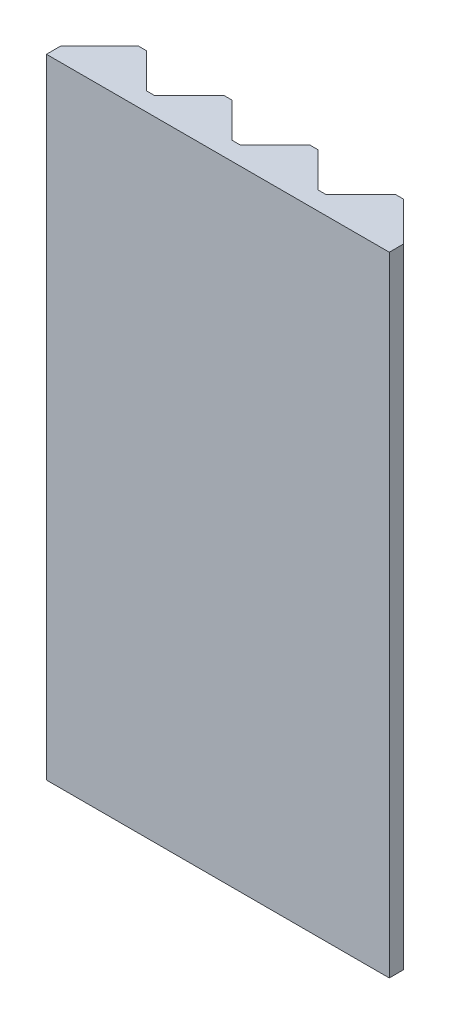
ISO-10303-21;
HEADER;
FILE_DESCRIPTION(('STEP AP214'),'2;1');
FILE_NAME('part.step','',(''),(''),'','','');
FILE_SCHEMA(('AUTOMOTIVE_DESIGN { 1 0 10303 214 1 1 1 1 }'));
ENDSEC;
DATA;
#1=APPLICATION_CONTEXT('core data for automotive mechanical design processes');
#2=APPLICATION_PROTOCOL_DEFINITION('international standard','automotive_design',2000,#1);
#3=PRODUCT_CONTEXT('',#1,'mechanical');
#4=PRODUCT('Part','Part','',(#3));
#5=PRODUCT_RELATED_PRODUCT_CATEGORY('part','',(#4));
#6=PRODUCT_DEFINITION_FORMATION('','',#4);
#7=PRODUCT_DEFINITION_CONTEXT('part definition',#1,'design');
#8=PRODUCT_DEFINITION('design','',#6,#7);
#9=PRODUCT_DEFINITION_SHAPE('','',#8);
#10=(LENGTH_UNIT() NAMED_UNIT(*) SI_UNIT(.MILLI.,.METRE.));
#11=(NAMED_UNIT(*) PLANE_ANGLE_UNIT() SI_UNIT($,.RADIAN.));
#12=(NAMED_UNIT(*) SI_UNIT($,.STERADIAN.) SOLID_ANGLE_UNIT());
#13=UNCERTAINTY_MEASURE_WITH_UNIT(LENGTH_MEASURE(1.E-05),#10,'distance_accuracy_value','');
#14=(GEOMETRIC_REPRESENTATION_CONTEXT(3) GLOBAL_UNCERTAINTY_ASSIGNED_CONTEXT((#13)) GLOBAL_UNIT_ASSIGNED_CONTEXT((#10,
#11,#12)) REPRESENTATION_CONTEXT('',''));
#15=CARTESIAN_POINT('',(0.,0.,0.));
#16=DIRECTION('',(0.,0.,1.));
#17=DIRECTION('',(1.,0.,0.));
#18=AXIS2_PLACEMENT_3D('',#15,#16,#17);
#19=CARTESIAN_POINT('',(-133.35,0.,-23.603948775785));
#20=DIRECTION('',(0.,0.,-1.));
#21=DIRECTION('',(-1.,0.,0.));
#22=AXIS2_PLACEMENT_3D('',#19,#20,#21);
#23=PLANE('',#22);
#24=DIRECTION('',(0.,1.,0.));
#25=VECTOR('',#24,1.);
#26=CARTESIAN_POINT('',(-131.553948775781,-139.7,-23.6039487757812));
#27=LINE('',#26,#25);
#28=CARTESIAN_POINT('',(-131.553948775778,-139.7,-23.6039487757841));
#29=VERTEX_POINT('',#28);
#30=CARTESIAN_POINT('',(-131.553948775779,139.7,-23.6039487757831));
#31=VERTEX_POINT('',#30);
#32=EDGE_CURVE('E206',#29,#31,#27,.T.);
#33=ORIENTED_EDGE('',*,*,#32,.F.);
#34=DIRECTION('',(1.,0.,0.));
#35=VECTOR('',#34,1.);
#36=CARTESIAN_POINT('',(0.,-139.7,-23.603948775785));
#37=LINE('',#36,#35);
#38=CARTESIAN_POINT('',(-135.146051224222,-139.7,-23.6039487757841));
#39=VERTEX_POINT('',#38);
#40=EDGE_CURVE('E148',#29,#39,#37,.F.);
#41=ORIENTED_EDGE('',*,*,#40,.T.);
#42=DIRECTION('',(0.,1.,0.));
#43=VECTOR('',#42,1.);
#44=CARTESIAN_POINT('',(-135.146051224219,-139.7,-23.6039487757812));
#45=LINE('',#44,#43);
#46=CARTESIAN_POINT('',(-135.146051224221,139.7,-23.6039487757831));
#47=VERTEX_POINT('',#46);
#48=EDGE_CURVE('E19',#47,#39,#45,.F.);
#49=ORIENTED_EDGE('',*,*,#48,.F.);
#50=DIRECTION('',(1.,0.,0.));
#51=VECTOR('',#50,1.);
#52=CARTESIAN_POINT('',(0.,139.7,-23.603948775785));
#53=LINE('',#52,#51);
#54=EDGE_CURVE('E145',#31,#47,#53,.F.);
#55=ORIENTED_EDGE('',*,*,#54,.F.);
#56=EDGE_LOOP('',(#33,#41,#49,#55));
#57=FACE_BOUND('',#56,.T.);
#58=ADVANCED_FACE('F16',(#57),#23,.T.);
#59=CARTESIAN_POINT('',(-133.35,-139.7,-25.4));
#60=DIRECTION('',(-0.707106781186548,0.,-0.707106781186548));
#61=DIRECTION('',(-0.707106781186548,0.,0.707106781186548));
#62=AXIS2_PLACEMENT_3D('',#59,#60,#61);
#63=PLANE('',#62);
#64=DIRECTION('',(-0.707106781186391,0.,0.707106781186704));
#65=VECTOR('',#64,1.);
#66=CARTESIAN_POINT('',(-135.146051224223,139.7,-23.603948775785));
#67=LINE('',#66,#65);
#68=CARTESIAN_POINT('',(-152.4,139.7,-6.35));
#69=VERTEX_POINT('',#68);
#70=EDGE_CURVE('E153',#47,#69,#67,.T.);
#71=ORIENTED_EDGE('',*,*,#70,.F.);
#72=ORIENTED_EDGE('',*,*,#48,.T.);
#73=DIRECTION('',(-0.707106781186391,0.,0.707106781186704));
#74=VECTOR('',#73,1.);
#75=CARTESIAN_POINT('',(-135.146051224223,-139.7,-23.603948775785));
#76=LINE('',#75,#74);
#77=CARTESIAN_POINT('',(-152.4,-139.7,-6.35000000000001));
#78=VERTEX_POINT('',#77);
#79=EDGE_CURVE('E261',#39,#78,#76,.T.);
#80=ORIENTED_EDGE('',*,*,#79,.T.);
#81=DIRECTION('',(0.,1.,0.));
#82=VECTOR('',#81,1.);
#83=CARTESIAN_POINT('',(-152.4,-139.7,-6.35));
#84=LINE('',#83,#82);
#85=EDGE_CURVE('E156',#69,#78,#84,.F.);
#86=ORIENTED_EDGE('',*,*,#85,.F.);
#87=EDGE_LOOP('',(#71,#72,#80,#86));
#88=FACE_BOUND('',#87,.T.);
#89=ADVANCED_FACE('F154',(#88),#63,.T.);
#90=CARTESIAN_POINT('',(-19.05,0.,-23.603948775785));
#91=DIRECTION('',(0.,0.,-1.));
#92=DIRECTION('',(-1.,0.,0.));
#93=AXIS2_PLACEMENT_3D('',#90,#91,#92);
#94=PLANE('',#93);
#95=DIRECTION('',(0.,1.,0.));
#96=VECTOR('',#95,1.);
#97=CARTESIAN_POINT('',(-17.253948775785,-139.7,-23.603948775785));
#98=LINE('',#97,#96);
#99=CARTESIAN_POINT('',(-17.253948775785,-139.7,-23.603948775785));
#100=VERTEX_POINT('',#99);
#101=CARTESIAN_POINT('',(-17.253948775785,139.7,-23.603948775785));
#102=VERTEX_POINT('',#101);
#103=EDGE_CURVE('E137',#100,#102,#98,.T.);
#104=ORIENTED_EDGE('',*,*,#103,.F.);
#105=DIRECTION('',(1.,0.,0.));
#106=VECTOR('',#105,1.);
#107=CARTESIAN_POINT('',(0.,-139.7,-23.603948775785));
#108=LINE('',#107,#106);
#109=CARTESIAN_POINT('',(-20.846051224215,-139.7,-23.603948775785));
#110=VERTEX_POINT('',#109);
#111=EDGE_CURVE('E248',#100,#110,#108,.F.);
#112=ORIENTED_EDGE('',*,*,#111,.T.);
#113=DIRECTION('',(0.,1.,0.));
#114=VECTOR('',#113,1.);
#115=CARTESIAN_POINT('',(-20.846051224215,-139.7,-23.603948775785));
#116=LINE('',#115,#114);
#117=CARTESIAN_POINT('',(-20.846051224215,139.7,-23.603948775785));
#118=VERTEX_POINT('',#117);
#119=EDGE_CURVE('E151',#118,#110,#116,.F.);
#120=ORIENTED_EDGE('',*,*,#119,.F.);
#121=DIRECTION('',(1.,0.,0.));
#122=VECTOR('',#121,1.);
#123=CARTESIAN_POINT('',(0.,139.7,-23.603948775785));
#124=LINE('',#123,#122);
#125=EDGE_CURVE('E200',#102,#118,#124,.F.);
#126=ORIENTED_EDGE('',*,*,#125,.F.);
#127=EDGE_LOOP('',(#104,#112,#120,#126));
#128=FACE_BOUND('',#127,.T.);
#129=ADVANCED_FACE('F329',(#128),#94,.T.);
#130=CARTESIAN_POINT('',(-19.05,-139.7,-25.4));
#131=DIRECTION('',(-0.707106781186548,0.,-0.707106781186548));
#132=DIRECTION('',(-0.707106781186548,0.,0.707106781186548));
#133=AXIS2_PLACEMENT_3D('',#130,#131,#132);
#134=PLANE('',#133);
#135=DIRECTION('',(-0.707106781186373,0.,0.707106781186722));
#136=VECTOR('',#135,1.);
#137=CARTESIAN_POINT('',(-20.846051224215,139.7,-23.603948775785));
#138=LINE('',#137,#136);
#139=CARTESIAN_POINT('',(-36.3039487757793,139.7,-8.14605122421688));
#140=VERTEX_POINT('',#139);
#141=EDGE_CURVE('E197',#118,#140,#138,.T.);
#142=ORIENTED_EDGE('',*,*,#141,.F.);
#143=ORIENTED_EDGE('',*,*,#119,.T.);
#144=DIRECTION('',(-0.707106781186373,0.,0.707106781186722));
#145=VECTOR('',#144,1.);
#146=CARTESIAN_POINT('',(-20.846051224215,-139.7,-23.603948775785));
#147=LINE('',#146,#145);
#148=CARTESIAN_POINT('',(-36.3039487757793,-139.7,-8.14605122421688));
#149=VERTEX_POINT('',#148);
#150=EDGE_CURVE('E242',#110,#149,#147,.T.);
#151=ORIENTED_EDGE('',*,*,#150,.T.);
#152=DIRECTION('',(0.,1.,0.));
#153=VECTOR('',#152,1.);
#154=CARTESIAN_POINT('',(-36.3039487757774,0.,-8.14605122421498));
#155=LINE('',#154,#153);
#156=EDGE_CURVE('E235',#140,#149,#155,.F.);
#157=ORIENTED_EDGE('',*,*,#156,.F.);
#158=EDGE_LOOP('',(#142,#143,#151,#157));
#159=FACE_BOUND('',#158,.T.);
#160=ADVANCED_FACE('F241',(#159),#134,.T.);
#161=CARTESIAN_POINT('',(-38.1,0.,-8.14605122421498));
#162=DIRECTION('',(0.,0.,-1.));
#163=DIRECTION('',(-1.,0.,0.));
#164=AXIS2_PLACEMENT_3D('',#161,#162,#163);
#165=PLANE('',#164);
#166=DIRECTION('',(1.,0.,0.));
#167=VECTOR('',#166,1.);
#168=CARTESIAN_POINT('',(0.,-139.7,-8.14605122421498));
#169=LINE('',#168,#167);
#170=CARTESIAN_POINT('',(-39.8960512242216,-139.7,-8.14605122421593));
#171=VERTEX_POINT('',#170);
#172=EDGE_CURVE('E250',#149,#171,#169,.F.);
#173=ORIENTED_EDGE('',*,*,#172,.T.);
#174=DIRECTION('',(0.,1.,0.));
#175=VECTOR('',#174,1.);
#176=CARTESIAN_POINT('',(-39.8960512242188,-139.7,-8.14605122421879));
#177=LINE('',#176,#175);
#178=CARTESIAN_POINT('',(-39.8960512242216,139.7,-8.14605122421593));
#179=VERTEX_POINT('',#178);
#180=EDGE_CURVE('E232',#179,#171,#177,.F.);
#181=ORIENTED_EDGE('',*,*,#180,.F.);
#182=DIRECTION('',(1.,0.,0.));
#183=VECTOR('',#182,1.);
#184=CARTESIAN_POINT('',(0.,139.7,-8.14605122421498));
#185=LINE('',#184,#183);
#186=EDGE_CURVE('E194',#140,#179,#185,.F.);
#187=ORIENTED_EDGE('',*,*,#186,.F.);
#188=ORIENTED_EDGE('',*,*,#156,.T.);
#189=EDGE_LOOP('',(#173,#181,#187,#188));
#190=FACE_BOUND('',#189,.T.);
#191=ADVANCED_FACE('F320',(#190),#165,.T.);
#192=CARTESIAN_POINT('',(-38.1,-139.7,-6.35));
#193=DIRECTION('',(0.707106781186548,0.,-0.707106781186548));
#194=DIRECTION('',(-0.707106781186548,0.,-0.707106781186548));
#195=AXIS2_PLACEMENT_3D('',#192,#193,#194);
#196=PLANE('',#195);
#197=DIRECTION('',(-0.707106781186199,0.,-0.707106781186896));
#198=VECTOR('',#197,1.);
#199=CARTESIAN_POINT('',(-39.8960512242226,-139.7,-8.14605122421498));
#200=LINE('',#199,#198);
#201=CARTESIAN_POINT('',(-55.3539487757793,-139.7,-23.6039487757831));
#202=VERTEX_POINT('',#201);
#203=EDGE_CURVE('E252',#171,#202,#200,.T.);
#204=ORIENTED_EDGE('',*,*,#203,.T.);
#205=DIRECTION('',(0.,1.,0.));
#206=VECTOR('',#205,1.);
#207=CARTESIAN_POINT('',(-55.3539487757774,0.,-23.603948775785));
#208=LINE('',#207,#206);
#209=CARTESIAN_POINT('',(-55.3539487757793,139.7,-23.6039487757831));
#210=VERTEX_POINT('',#209);
#211=EDGE_CURVE('E229',#210,#202,#208,.F.);
#212=ORIENTED_EDGE('',*,*,#211,.F.);
#213=DIRECTION('',(-0.707106781186199,0.,-0.707106781186896));
#214=VECTOR('',#213,1.);
#215=CARTESIAN_POINT('',(-39.8960512242226,139.7,-8.14605122421498));
#216=LINE('',#215,#214);
#217=EDGE_CURVE('E191',#179,#210,#216,.T.);
#218=ORIENTED_EDGE('',*,*,#217,.F.);
#219=ORIENTED_EDGE('',*,*,#180,.T.);
#220=EDGE_LOOP('',(#204,#212,#218,#219));
#221=FACE_BOUND('',#220,.T.);
#222=ADVANCED_FACE('F302',(#221),#196,.T.);
#223=CARTESIAN_POINT('',(-57.15,0.,-23.603948775785));
#224=DIRECTION('',(0.,0.,-1.));
#225=DIRECTION('',(-1.,0.,0.));
#226=AXIS2_PLACEMENT_3D('',#223,#224,#225);
#227=PLANE('',#226);
#228=ORIENTED_EDGE('',*,*,#211,.T.);
#229=DIRECTION('',(1.,0.,0.));
#230=VECTOR('',#229,1.);
#231=CARTESIAN_POINT('',(0.,-139.7,-23.603948775785));
#232=LINE('',#231,#230);
#233=CARTESIAN_POINT('',(-58.9460512242216,-139.7,-23.6039487757841));
#234=VERTEX_POINT('',#233);
#235=EDGE_CURVE('E300',#202,#234,#232,.F.);
#236=ORIENTED_EDGE('',*,*,#235,.T.);
#237=DIRECTION('',(0.,1.,0.));
#238=VECTOR('',#237,1.);
#239=CARTESIAN_POINT('',(-58.9460512242188,-139.7,-23.6039487757812));
#240=LINE('',#239,#238);
#241=CARTESIAN_POINT('',(-58.9460512242216,139.7,-23.6039487757841));
#242=VERTEX_POINT('',#241);
#243=EDGE_CURVE('E226',#242,#234,#240,.F.);
#244=ORIENTED_EDGE('',*,*,#243,.F.);
#245=DIRECTION('',(1.,0.,0.));
#246=VECTOR('',#245,1.);
#247=CARTESIAN_POINT('',(0.,139.7,-23.603948775785));
#248=LINE('',#247,#246);
#249=EDGE_CURVE('E188',#210,#242,#248,.F.);
#250=ORIENTED_EDGE('',*,*,#249,.F.);
#251=EDGE_LOOP('',(#228,#236,#244,#250));
#252=FACE_BOUND('',#251,.T.);
#253=ADVANCED_FACE('F307',(#252),#227,.T.);
#254=CARTESIAN_POINT('',(-57.15,-139.7,-25.4));
#255=DIRECTION('',(-0.707106781186548,0.,-0.707106781186548));
#256=DIRECTION('',(-0.707106781186548,0.,0.707106781186548));
#257=AXIS2_PLACEMENT_3D('',#254,#255,#256);
#258=PLANE('',#257);
#259=DIRECTION('',(-0.707106781186199,0.,0.707106781186896));
#260=VECTOR('',#259,1.);
#261=CARTESIAN_POINT('',(-58.9460512242226,139.7,-23.603948775785));
#262=LINE('',#261,#260);
#263=CARTESIAN_POINT('',(-74.4039487757793,139.7,-8.14605122421688));
#264=VERTEX_POINT('',#263);
#265=EDGE_CURVE('E185',#242,#264,#262,.T.);
#266=ORIENTED_EDGE('',*,*,#265,.F.);
#267=ORIENTED_EDGE('',*,*,#243,.T.);
#268=DIRECTION('',(-0.707106781186199,0.,0.707106781186896));
#269=VECTOR('',#268,1.);
#270=CARTESIAN_POINT('',(-58.9460512242226,-139.7,-23.603948775785));
#271=LINE('',#270,#269);
#272=CARTESIAN_POINT('',(-74.4039487757793,-139.7,-8.14605122421688));
#273=VERTEX_POINT('',#272);
#274=EDGE_CURVE('E298',#234,#273,#271,.T.);
#275=ORIENTED_EDGE('',*,*,#274,.T.);
#276=DIRECTION('',(0.,1.,0.));
#277=VECTOR('',#276,1.);
#278=CARTESIAN_POINT('',(-74.4039487757774,0.,-8.14605122421498));
#279=LINE('',#278,#277);
#280=EDGE_CURVE('E223',#264,#273,#279,.F.);
#281=ORIENTED_EDGE('',*,*,#280,.F.);
#282=EDGE_LOOP('',(#266,#267,#275,#281));
#283=FACE_BOUND('',#282,.T.);
#284=ADVANCED_FACE('F313',(#283),#258,.T.);
#285=CARTESIAN_POINT('',(-76.2,0.,-8.14605122421498));
#286=DIRECTION('',(0.,0.,-1.));
#287=DIRECTION('',(-1.,0.,0.));
#288=AXIS2_PLACEMENT_3D('',#285,#286,#287);
#289=PLANE('',#288);
#290=DIRECTION('',(1.,0.,0.));
#291=VECTOR('',#290,1.);
#292=CARTESIAN_POINT('',(0.,-139.7,-8.14605122421498));
#293=LINE('',#292,#291);
#294=CARTESIAN_POINT('',(-77.9960512242216,-139.7,-8.14605122421593));
#295=VERTEX_POINT('',#294);
#296=EDGE_CURVE('E296',#273,#295,#293,.F.);
#297=ORIENTED_EDGE('',*,*,#296,.T.);
#298=DIRECTION('',(0.,1.,0.));
#299=VECTOR('',#298,1.);
#300=CARTESIAN_POINT('',(-77.9960512242188,-139.7,-8.14605122421879));
#301=LINE('',#300,#299);
#302=CARTESIAN_POINT('',(-77.9960512242216,139.7,-8.14605122421593));
#303=VERTEX_POINT('',#302);
#304=EDGE_CURVE('E220',#303,#295,#301,.F.);
#305=ORIENTED_EDGE('',*,*,#304,.F.);
#306=DIRECTION('',(1.,0.,0.));
#307=VECTOR('',#306,1.);
#308=CARTESIAN_POINT('',(0.,139.7,-8.14605122421498));
#309=LINE('',#308,#307);
#310=EDGE_CURVE('E182',#264,#303,#309,.F.);
#311=ORIENTED_EDGE('',*,*,#310,.F.);
#312=ORIENTED_EDGE('',*,*,#280,.T.);
#313=EDGE_LOOP('',(#297,#305,#311,#312));
#314=FACE_BOUND('',#313,.T.);
#315=ADVANCED_FACE('F316',(#314),#289,.T.);
#316=CARTESIAN_POINT('',(-76.2,-139.7,-6.35));
#317=DIRECTION('',(0.707106781186548,0.,-0.707106781186548));
#318=DIRECTION('',(-0.707106781186548,0.,-0.707106781186548));
#319=AXIS2_PLACEMENT_3D('',#316,#317,#318);
#320=PLANE('',#319);
#321=DIRECTION('',(-0.707106781186199,0.,-0.707106781186896));
#322=VECTOR('',#321,1.);
#323=CARTESIAN_POINT('',(-77.9960512242226,-139.7,-8.14605122421498));
#324=LINE('',#323,#322);
#325=CARTESIAN_POINT('',(-93.4539487757793,-139.7,-23.6039487757831));
#326=VERTEX_POINT('',#325);
#327=EDGE_CURVE('E294',#295,#326,#324,.T.);
#328=ORIENTED_EDGE('',*,*,#327,.T.);
#329=DIRECTION('',(0.,1.,0.));
#330=VECTOR('',#329,1.);
#331=CARTESIAN_POINT('',(-93.4539487757774,0.,-23.603948775785));
#332=LINE('',#331,#330);
#333=CARTESIAN_POINT('',(-93.4539487757793,139.7,-23.6039487757831));
#334=VERTEX_POINT('',#333);
#335=EDGE_CURVE('E217',#334,#326,#332,.F.);
#336=ORIENTED_EDGE('',*,*,#335,.F.);
#337=DIRECTION('',(-0.707106781186199,0.,-0.707106781186896));
#338=VECTOR('',#337,1.);
#339=CARTESIAN_POINT('',(-77.9960512242226,139.7,-8.14605122421498));
#340=LINE('',#339,#338);
#341=EDGE_CURVE('E179',#303,#334,#340,.T.);
#342=ORIENTED_EDGE('',*,*,#341,.F.);
#343=ORIENTED_EDGE('',*,*,#304,.T.);
#344=EDGE_LOOP('',(#328,#336,#342,#343));
#345=FACE_BOUND('',#344,.T.);
#346=ADVANCED_FACE('F364',(#345),#320,.T.);
#347=CARTESIAN_POINT('',(-95.25,0.,-23.603948775785));
#348=DIRECTION('',(0.,0.,-1.));
#349=DIRECTION('',(-1.,0.,0.));
#350=AXIS2_PLACEMENT_3D('',#347,#348,#349);
#351=PLANE('',#350);
#352=ORIENTED_EDGE('',*,*,#335,.T.);
#353=DIRECTION('',(1.,0.,0.));
#354=VECTOR('',#353,1.);
#355=CARTESIAN_POINT('',(0.,-139.7,-23.603948775785));
#356=LINE('',#355,#354);
#357=CARTESIAN_POINT('',(-97.0460512242216,-139.7,-23.6039487757841));
#358=VERTEX_POINT('',#357);
#359=EDGE_CURVE('E292',#326,#358,#356,.F.);
#360=ORIENTED_EDGE('',*,*,#359,.T.);
#361=DIRECTION('',(0.,1.,0.));
#362=VECTOR('',#361,1.);
#363=CARTESIAN_POINT('',(-97.0460512242188,-139.7,-23.6039487757812));
#364=LINE('',#363,#362);
#365=CARTESIAN_POINT('',(-97.0460512242216,139.7,-23.6039487757841));
#366=VERTEX_POINT('',#365);
#367=EDGE_CURVE('E214',#366,#358,#364,.F.);
#368=ORIENTED_EDGE('',*,*,#367,.F.);
#369=DIRECTION('',(1.,0.,0.));
#370=VECTOR('',#369,1.);
#371=CARTESIAN_POINT('',(0.,139.7,-23.603948775785));
#372=LINE('',#371,#370);
#373=EDGE_CURVE('E176',#334,#366,#372,.F.);
#374=ORIENTED_EDGE('',*,*,#373,.F.);
#375=EDGE_LOOP('',(#352,#360,#368,#374));
#376=FACE_BOUND('',#375,.T.);
#377=ADVANCED_FACE('F360',(#376),#351,.T.);
#378=CARTESIAN_POINT('',(-95.25,-139.7,-25.4));
#379=DIRECTION('',(-0.707106781186548,0.,-0.707106781186548));
#380=DIRECTION('',(-0.707106781186548,0.,0.707106781186548));
#381=AXIS2_PLACEMENT_3D('',#378,#379,#380);
#382=PLANE('',#381);
#383=DIRECTION('',(-0.707106781186199,0.,0.707106781186896));
#384=VECTOR('',#383,1.);
#385=CARTESIAN_POINT('',(-97.0460512242226,139.7,-23.603948775785));
#386=LINE('',#385,#384);
#387=CARTESIAN_POINT('',(-112.503948775779,139.7,-8.14605122421688));
#388=VERTEX_POINT('',#387);
#389=EDGE_CURVE('E173',#366,#388,#386,.T.);
#390=ORIENTED_EDGE('',*,*,#389,.F.);
#391=ORIENTED_EDGE('',*,*,#367,.T.);
#392=DIRECTION('',(-0.707106781186199,0.,0.707106781186896));
#393=VECTOR('',#392,1.);
#394=CARTESIAN_POINT('',(-97.0460512242226,-139.7,-23.603948775785));
#395=LINE('',#394,#393);
#396=CARTESIAN_POINT('',(-112.503948775779,-139.7,-8.14605122421689));
#397=VERTEX_POINT('',#396);
#398=EDGE_CURVE('E290',#358,#397,#395,.T.);
#399=ORIENTED_EDGE('',*,*,#398,.T.);
#400=DIRECTION('',(0.,1.,0.));
#401=VECTOR('',#400,1.);
#402=CARTESIAN_POINT('',(-112.503948775777,0.,-8.14605122421498));
#403=LINE('',#402,#401);
#404=EDGE_CURVE('E211',#388,#397,#403,.F.);
#405=ORIENTED_EDGE('',*,*,#404,.F.);
#406=EDGE_LOOP('',(#390,#391,#399,#405));
#407=FACE_BOUND('',#406,.T.);
#408=ADVANCED_FACE('F356',(#407),#382,.T.);
#409=CARTESIAN_POINT('',(-114.3,0.,-8.14605122421498));
#410=DIRECTION('',(0.,0.,-1.));
#411=DIRECTION('',(-1.,0.,0.));
#412=AXIS2_PLACEMENT_3D('',#409,#410,#411);
#413=PLANE('',#412);
#414=DIRECTION('',(1.,0.,0.));
#415=VECTOR('',#414,1.);
#416=CARTESIAN_POINT('',(0.,-139.7,-8.14605122421498));
#417=LINE('',#416,#415);
#418=CARTESIAN_POINT('',(-116.096051224222,-139.7,-8.14605122421593));
#419=VERTEX_POINT('',#418);
#420=EDGE_CURVE('E288',#397,#419,#417,.F.);
#421=ORIENTED_EDGE('',*,*,#420,.T.);
#422=DIRECTION('',(0.,1.,0.));
#423=VECTOR('',#422,1.);
#424=CARTESIAN_POINT('',(-116.096051224219,-139.7,-8.14605122421879));
#425=LINE('',#424,#423);
#426=CARTESIAN_POINT('',(-116.096051224222,139.7,-8.14605122421593));
#427=VERTEX_POINT('',#426);
#428=EDGE_CURVE('E208',#427,#419,#425,.F.);
#429=ORIENTED_EDGE('',*,*,#428,.F.);
#430=DIRECTION('',(1.,0.,0.));
#431=VECTOR('',#430,1.);
#432=CARTESIAN_POINT('',(0.,139.7,-8.14605122421498));
#433=LINE('',#432,#431);
#434=EDGE_CURVE('E168',#388,#427,#433,.F.);
#435=ORIENTED_EDGE('',*,*,#434,.F.);
#436=ORIENTED_EDGE('',*,*,#404,.T.);
#437=EDGE_LOOP('',(#421,#429,#435,#436));
#438=FACE_BOUND('',#437,.T.);
#439=ADVANCED_FACE('F352',(#438),#413,.T.);
#440=CARTESIAN_POINT('',(-114.3,-139.7,-6.35));
#441=DIRECTION('',(0.707106781186548,0.,-0.707106781186548));
#442=DIRECTION('',(-0.707106781186548,0.,-0.707106781186548));
#443=AXIS2_PLACEMENT_3D('',#440,#441,#442);
#444=PLANE('',#443);
#445=DIRECTION('',(-0.707106781186199,0.,-0.707106781186896));
#446=VECTOR('',#445,1.);
#447=CARTESIAN_POINT('',(-116.096051224223,-139.7,-8.14605122421498));
#448=LINE('',#447,#446);
#449=EDGE_CURVE('E285',#419,#29,#448,.T.);
#450=ORIENTED_EDGE('',*,*,#449,.T.);
#451=ORIENTED_EDGE('',*,*,#32,.T.);
#452=DIRECTION('',(-0.707106781186199,0.,-0.707106781186896));
#453=VECTOR('',#452,1.);
#454=CARTESIAN_POINT('',(-116.096051224223,139.7,-8.14605122421498));
#455=LINE('',#454,#453);
#456=EDGE_CURVE('E164',#427,#31,#455,.T.);
#457=ORIENTED_EDGE('',*,*,#456,.F.);
#458=ORIENTED_EDGE('',*,*,#428,.T.);
#459=EDGE_LOOP('',(#450,#451,#457,#458));
#460=FACE_BOUND('',#459,.T.);
#461=ADVANCED_FACE('F349',(#460),#444,.T.);
#462=CARTESIAN_POINT('',(0.,-139.7,-6.35));
#463=DIRECTION('',(0.707106781186548,0.,-0.707106781186548));
#464=DIRECTION('',(-0.707106781186548,0.,-0.707106781186548));
#465=AXIS2_PLACEMENT_3D('',#462,#463,#464);
#466=PLANE('',#465);
#467=DIRECTION('',(-0.707106781186548,0.,-0.707106781186548));
#468=VECTOR('',#467,1.);
#469=CARTESIAN_POINT('',(0.,-139.7,-6.35));
#470=LINE('',#469,#468);
#471=CARTESIAN_POINT('',(0.,-139.7,-6.35));
#472=VERTEX_POINT('',#471);
#473=EDGE_CURVE('E254',#472,#100,#470,.T.);
#474=ORIENTED_EDGE('',*,*,#473,.T.);
#475=ORIENTED_EDGE('',*,*,#103,.T.);
#476=DIRECTION('',(-0.707106781186548,0.,-0.707106781186548));
#477=VECTOR('',#476,1.);
#478=CARTESIAN_POINT('',(0.,139.7,-6.35));
#479=LINE('',#478,#477);
#480=CARTESIAN_POINT('',(0.,139.7,-6.35));
#481=VERTEX_POINT('',#480);
#482=EDGE_CURVE('E159',#481,#102,#479,.T.);
#483=ORIENTED_EDGE('',*,*,#482,.F.);
#484=DIRECTION('',(0.,1.,0.));
#485=VECTOR('',#484,1.);
#486=CARTESIAN_POINT('',(0.,139.7,-6.35));
#487=LINE('',#486,#485);
#488=EDGE_CURVE('E276',#481,#472,#487,.F.);
#489=ORIENTED_EDGE('',*,*,#488,.T.);
#490=EDGE_LOOP('',(#474,#475,#483,#489));
#491=FACE_BOUND('',#490,.T.);
#492=ADVANCED_FACE('F346',(#491),#466,.T.);
#493=CARTESIAN_POINT('',(0.,139.7,0.));
#494=DIRECTION('',(0.,1.,0.));
#495=DIRECTION('',(0.,0.,1.));
#496=AXIS2_PLACEMENT_3D('',#493,#494,#495);
#497=PLANE('',#496);
#498=ORIENTED_EDGE('',*,*,#456,.T.);
#499=ORIENTED_EDGE('',*,*,#54,.T.);
#500=ORIENTED_EDGE('',*,*,#70,.T.);
#501=DIRECTION('',(0.,0.,1.));
#502=VECTOR('',#501,1.);
#503=CARTESIAN_POINT('',(-152.4,139.7,-6.35));
#504=LINE('',#503,#502);
#505=CARTESIAN_POINT('',(-152.4,139.7,0.));
#506=VERTEX_POINT('',#505);
#507=EDGE_CURVE('E165',#506,#69,#504,.F.);
#508=ORIENTED_EDGE('',*,*,#507,.F.);
#509=DIRECTION('',(1.,0.,0.));
#510=VECTOR('',#509,1.);
#511=CARTESIAN_POINT('',(-152.4,139.7,0.));
#512=LINE('',#511,#510);
#513=CARTESIAN_POINT('',(0.,139.7,0.));
#514=VERTEX_POINT('',#513);
#515=EDGE_CURVE('E274',#514,#506,#512,.F.);
#516=ORIENTED_EDGE('',*,*,#515,.F.);
#517=DIRECTION('',(0.,0.,1.));
#518=VECTOR('',#517,1.);
#519=CARTESIAN_POINT('',(0.,139.7,0.));
#520=LINE('',#519,#518);
#521=EDGE_CURVE('E281',#514,#481,#520,.F.);
#522=ORIENTED_EDGE('',*,*,#521,.T.);
#523=ORIENTED_EDGE('',*,*,#482,.T.);
#524=ORIENTED_EDGE('',*,*,#125,.T.);
#525=ORIENTED_EDGE('',*,*,#141,.T.);
#526=ORIENTED_EDGE('',*,*,#186,.T.);
#527=ORIENTED_EDGE('',*,*,#217,.T.);
#528=ORIENTED_EDGE('',*,*,#249,.T.);
#529=ORIENTED_EDGE('',*,*,#265,.T.);
#530=ORIENTED_EDGE('',*,*,#310,.T.);
#531=ORIENTED_EDGE('',*,*,#341,.T.);
#532=ORIENTED_EDGE('',*,*,#373,.T.);
#533=ORIENTED_EDGE('',*,*,#389,.T.);
#534=ORIENTED_EDGE('',*,*,#434,.T.);
#535=EDGE_LOOP('',(#498,#499,#500,#508,#516,#522,#523,#524,#525,#526,#527,#528,#529,#530,#531,
#532,#533,#534));
#536=FACE_BOUND('',#535,.T.);
#537=ADVANCED_FACE('F161',(#536),#497,.T.);
#538=CARTESIAN_POINT('',(-152.4,-139.7,-6.35));
#539=DIRECTION('',(-1.,0.,0.));
#540=DIRECTION('',(0.,0.,1.));
#541=AXIS2_PLACEMENT_3D('',#538,#539,#540);
#542=PLANE('',#541);
#543=ORIENTED_EDGE('',*,*,#85,.T.);
#544=DIRECTION('',(0.,0.,1.));
#545=VECTOR('',#544,1.);
#546=CARTESIAN_POINT('',(-152.4,-139.7,0.));
#547=LINE('',#546,#545);
#548=CARTESIAN_POINT('',(-152.4,-139.7,0.));
#549=VERTEX_POINT('',#548);
#550=EDGE_CURVE('E259',#78,#549,#547,.T.);
#551=ORIENTED_EDGE('',*,*,#550,.T.);
#552=DIRECTION('',(0.,1.,0.));
#553=VECTOR('',#552,1.);
#554=CARTESIAN_POINT('',(-152.4,-139.7,0.));
#555=LINE('',#554,#553);
#556=EDGE_CURVE('E270',#506,#549,#555,.F.);
#557=ORIENTED_EDGE('',*,*,#556,.F.);
#558=ORIENTED_EDGE('',*,*,#507,.T.);
#559=EDGE_LOOP('',(#543,#551,#557,#558));
#560=FACE_BOUND('',#559,.T.);
#561=ADVANCED_FACE('F265',(#560),#542,.T.);
#562=CARTESIAN_POINT('',(0.,-139.7,0.));
#563=DIRECTION('',(0.,1.,0.));
#564=DIRECTION('',(0.,0.,1.));
#565=AXIS2_PLACEMENT_3D('',#562,#563,#564);
#566=PLANE('',#565);
#567=ORIENTED_EDGE('',*,*,#420,.F.);
#568=ORIENTED_EDGE('',*,*,#398,.F.);
#569=ORIENTED_EDGE('',*,*,#359,.F.);
#570=ORIENTED_EDGE('',*,*,#327,.F.);
#571=ORIENTED_EDGE('',*,*,#296,.F.);
#572=ORIENTED_EDGE('',*,*,#274,.F.);
#573=ORIENTED_EDGE('',*,*,#235,.F.);
#574=ORIENTED_EDGE('',*,*,#203,.F.);
#575=ORIENTED_EDGE('',*,*,#172,.F.);
#576=ORIENTED_EDGE('',*,*,#150,.F.);
#577=ORIENTED_EDGE('',*,*,#111,.F.);
#578=ORIENTED_EDGE('',*,*,#473,.F.);
#579=DIRECTION('',(0.,0.,1.));
#580=VECTOR('',#579,1.);
#581=CARTESIAN_POINT('',(0.,-139.7,0.));
#582=LINE('',#581,#580);
#583=CARTESIAN_POINT('',(0.,-139.7,0.));
#584=VERTEX_POINT('',#583);
#585=EDGE_CURVE('E34',#472,#584,#582,.T.);
#586=ORIENTED_EDGE('',*,*,#585,.T.);
#587=DIRECTION('',(1.,0.,0.));
#588=VECTOR('',#587,1.);
#589=CARTESIAN_POINT('',(-152.4,-139.7,0.));
#590=LINE('',#589,#588);
#591=EDGE_CURVE('E25',#549,#584,#590,.T.);
#592=ORIENTED_EDGE('',*,*,#591,.F.);
#593=ORIENTED_EDGE('',*,*,#550,.F.);
#594=ORIENTED_EDGE('',*,*,#79,.F.);
#595=ORIENTED_EDGE('',*,*,#40,.F.);
#596=ORIENTED_EDGE('',*,*,#449,.F.);
#597=EDGE_LOOP('',(#567,#568,#569,#570,#571,#572,#573,#574,#575,#576,#577,#578,#586,#592,#593,
#594,#595,#596));
#598=FACE_BOUND('',#597,.T.);
#599=ADVANCED_FACE('F247',(#598),#566,.F.);
#600=CARTESIAN_POINT('',(0.,139.7,0.));
#601=DIRECTION('',(-1.,0.,0.));
#602=DIRECTION('',(0.,0.,1.));
#603=AXIS2_PLACEMENT_3D('',#600,#601,#602);
#604=PLANE('',#603);
#605=ORIENTED_EDGE('',*,*,#521,.F.);
#606=DIRECTION('',(0.,1.,0.));
#607=VECTOR('',#606,1.);
#608=CARTESIAN_POINT('',(0.,-139.7,0.));
#609=LINE('',#608,#607);
#610=EDGE_CURVE('E11',#584,#514,#609,.T.);
#611=ORIENTED_EDGE('',*,*,#610,.F.);
#612=ORIENTED_EDGE('',*,*,#585,.F.);
#613=ORIENTED_EDGE('',*,*,#488,.F.);
#614=EDGE_LOOP('',(#605,#611,#612,#613));
#615=FACE_BOUND('',#614,.T.);
#616=ADVANCED_FACE('F332',(#615),#604,.F.);
#617=CARTESIAN_POINT('',(-152.4,-139.7,0.));
#618=DIRECTION('',(0.,0.,1.));
#619=DIRECTION('',(1.,0.,0.));
#620=AXIS2_PLACEMENT_3D('',#617,#618,#619);
#621=PLANE('',#620);
#622=ORIENTED_EDGE('',*,*,#591,.T.);
#623=ORIENTED_EDGE('',*,*,#610,.T.);
#624=ORIENTED_EDGE('',*,*,#515,.T.);
#625=ORIENTED_EDGE('',*,*,#556,.T.);
#626=EDGE_LOOP('',(#622,#623,#624,#625));
#627=FACE_BOUND('',#626,.T.);
#628=ADVANCED_FACE('F273',(#627),#621,.T.);
#629=CLOSED_SHELL('',(#58,#89,#129,#160,#191,#222,#253,#284,#315,#346,#377,#408,#439,#461,#492,
#537,#561,#599,#616,#628));
#630=MANIFOLD_SOLID_BREP('B1',#629);
#631=ADVANCED_BREP_SHAPE_REPRESENTATION('',(#18,#630),#14);
#632=SHAPE_DEFINITION_REPRESENTATION(#9,#631);
ENDSEC;
END-ISO-10303-21;
